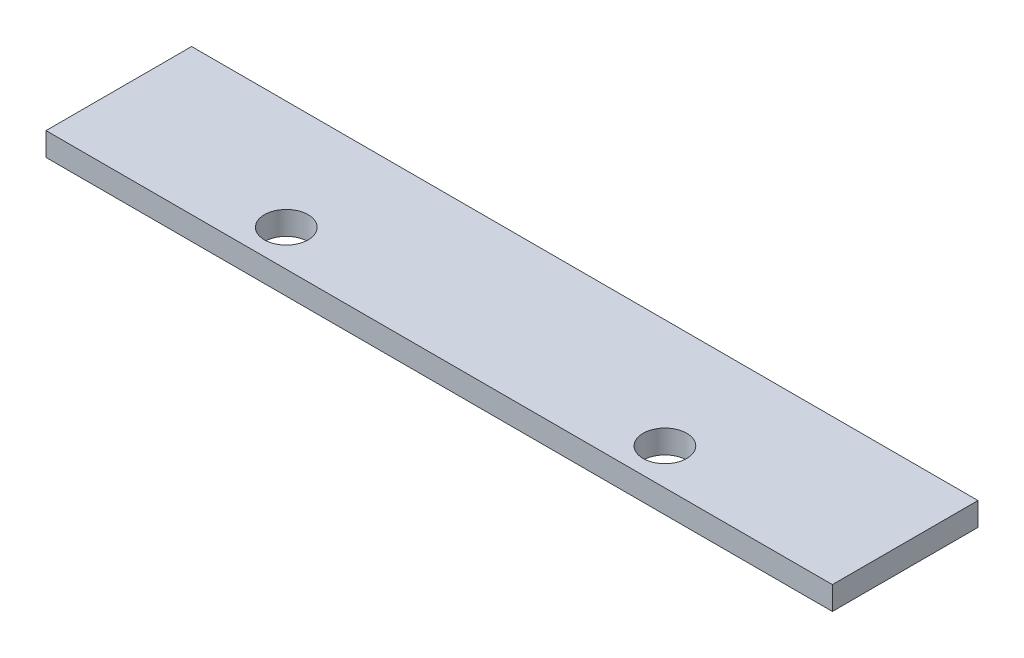
ISO-10303-21;
HEADER;
FILE_DESCRIPTION(('STEP AP214'),'2;1');
FILE_NAME('part.step','',(''),(''),'','','');
FILE_SCHEMA(('AUTOMOTIVE_DESIGN { 1 0 10303 214 1 1 1 1 }'));
ENDSEC;
DATA;
#1=APPLICATION_CONTEXT('core data for automotive mechanical design processes');
#2=APPLICATION_PROTOCOL_DEFINITION('international standard','automotive_design',2000,#1);
#3=PRODUCT_CONTEXT('',#1,'mechanical');
#4=PRODUCT('Part','Part','',(#3));
#5=PRODUCT_RELATED_PRODUCT_CATEGORY('part','',(#4));
#6=PRODUCT_DEFINITION_FORMATION('','',#4);
#7=PRODUCT_DEFINITION_CONTEXT('part definition',#1,'design');
#8=PRODUCT_DEFINITION('design','',#6,#7);
#9=PRODUCT_DEFINITION_SHAPE('','',#8);
#10=(LENGTH_UNIT() NAMED_UNIT(*) SI_UNIT(.MILLI.,.METRE.));
#11=(NAMED_UNIT(*) PLANE_ANGLE_UNIT() SI_UNIT($,.RADIAN.));
#12=(NAMED_UNIT(*) SI_UNIT($,.STERADIAN.) SOLID_ANGLE_UNIT());
#13=UNCERTAINTY_MEASURE_WITH_UNIT(LENGTH_MEASURE(1.E-05),#10,'distance_accuracy_value','');
#14=(GEOMETRIC_REPRESENTATION_CONTEXT(3) GLOBAL_UNCERTAINTY_ASSIGNED_CONTEXT((#13)) GLOBAL_UNIT_ASSIGNED_CONTEXT((#10,
#11,#12)) REPRESENTATION_CONTEXT('',''));
#15=CARTESIAN_POINT('',(0.,0.,0.));
#16=DIRECTION('',(0.,0.,1.));
#17=DIRECTION('',(1.,0.,0.));
#18=AXIS2_PLACEMENT_3D('',#15,#16,#17);
#19=CARTESIAN_POINT('',(0.,1.6,0.));
#20=DIRECTION('',(0.,1.,0.));
#21=DIRECTION('',(0.,0.,1.));
#22=AXIS2_PLACEMENT_3D('',#19,#20,#21);
#23=PLANE('',#22);
#24=CARTESIAN_POINT('',(-13.,1.6,2.49999999999999));
#25=DIRECTION('',(0.,1.,0.));
#26=DIRECTION('',(0.,0.,1.));
#27=AXIS2_PLACEMENT_3D('',#24,#25,#26);
#28=CIRCLE('',#27,1.5);
#29=CARTESIAN_POINT('',(-13.,1.6,3.99999999999999));
#30=VERTEX_POINT('',#29);
#31=EDGE_CURVE('E104',#30,#30,#28,.T.);
#32=ORIENTED_EDGE('',*,*,#31,.F.);
#33=EDGE_LOOP('',(#32));
#34=FACE_BOUND('',#33,.T.);
#35=DIRECTION('',(0.,0.,-1.));
#36=VECTOR('',#35,1.);
#37=CARTESIAN_POINT('',(27.,1.6,-5.));
#38=LINE('',#37,#36);
#39=CARTESIAN_POINT('',(27.,1.6,5.));
#40=VERTEX_POINT('',#39);
#41=CARTESIAN_POINT('',(27.,1.6,-5.));
#42=VERTEX_POINT('',#41);
#43=EDGE_CURVE('E89',#40,#42,#38,.T.);
#44=ORIENTED_EDGE('',*,*,#43,.T.);
#45=DIRECTION('',(-1.,0.,0.));
#46=VECTOR('',#45,1.);
#47=CARTESIAN_POINT('',(-27.,1.6,-5.));
#48=LINE('',#47,#46);
#49=CARTESIAN_POINT('',(-27.,1.6,-5.));
#50=VERTEX_POINT('',#49);
#51=EDGE_CURVE('E84',#42,#50,#48,.T.);
#52=ORIENTED_EDGE('',*,*,#51,.T.);
#53=DIRECTION('',(0.,0.,1.));
#54=VECTOR('',#53,1.);
#55=CARTESIAN_POINT('',(-27.,1.6,-5.));
#56=LINE('',#55,#54);
#57=CARTESIAN_POINT('',(-27.,1.6,5.));
#58=VERTEX_POINT('',#57);
#59=EDGE_CURVE('E87',#50,#58,#56,.T.);
#60=ORIENTED_EDGE('',*,*,#59,.T.);
#61=DIRECTION('',(1.,0.,0.));
#62=VECTOR('',#61,1.);
#63=CARTESIAN_POINT('',(-27.,1.6,5.));
#64=LINE('',#63,#62);
#65=EDGE_CURVE('E54',#58,#40,#64,.T.);
#66=ORIENTED_EDGE('',*,*,#65,.T.);
#67=EDGE_LOOP('',(#44,#52,#60,#66));
#68=FACE_BOUND('',#67,.T.);
#69=CARTESIAN_POINT('',(13.,1.6,2.49999999999999));
#70=DIRECTION('',(0.,1.,0.));
#71=DIRECTION('',(0.,0.,1.));
#72=AXIS2_PLACEMENT_3D('',#69,#70,#71);
#73=CIRCLE('',#72,1.5);
#74=CARTESIAN_POINT('',(13.,1.6,3.99999999999999));
#75=VERTEX_POINT('',#74);
#76=EDGE_CURVE('E119',#75,#75,#73,.T.);
#77=ORIENTED_EDGE('',*,*,#76,.F.);
#78=EDGE_LOOP('',(#77));
#79=FACE_BOUND('',#78,.T.);
#80=ADVANCED_FACE('F37',(#34,#68,#79),#23,.T.);
#81=CARTESIAN_POINT('',(0.,0.,0.));
#82=DIRECTION('',(0.,1.,0.));
#83=DIRECTION('',(0.,0.,1.));
#84=AXIS2_PLACEMENT_3D('',#81,#82,#83);
#85=PLANE('',#84);
#86=DIRECTION('',(0.,0.,-1.));
#87=VECTOR('',#86,1.);
#88=CARTESIAN_POINT('',(27.,0.,-5.));
#89=LINE('',#88,#87);
#90=CARTESIAN_POINT('',(27.,0.,5.));
#91=VERTEX_POINT('',#90);
#92=CARTESIAN_POINT('',(27.,0.,-5.));
#93=VERTEX_POINT('',#92);
#94=EDGE_CURVE('E101',#91,#93,#89,.T.);
#95=ORIENTED_EDGE('',*,*,#94,.F.);
#96=DIRECTION('',(1.,0.,0.));
#97=VECTOR('',#96,1.);
#98=CARTESIAN_POINT('',(-27.,0.,5.));
#99=LINE('',#98,#97);
#100=CARTESIAN_POINT('',(-27.,0.,5.));
#101=VERTEX_POINT('',#100);
#102=EDGE_CURVE('E77',#101,#91,#99,.T.);
#103=ORIENTED_EDGE('',*,*,#102,.F.);
#104=DIRECTION('',(0.,0.,1.));
#105=VECTOR('',#104,1.);
#106=CARTESIAN_POINT('',(-27.,0.,-5.));
#107=LINE('',#106,#105);
#108=CARTESIAN_POINT('',(-27.,0.,-5.));
#109=VERTEX_POINT('',#108);
#110=EDGE_CURVE('E71',#109,#101,#107,.T.);
#111=ORIENTED_EDGE('',*,*,#110,.F.);
#112=DIRECTION('',(-1.,0.,0.));
#113=VECTOR('',#112,1.);
#114=CARTESIAN_POINT('',(-27.,0.,-5.));
#115=LINE('',#114,#113);
#116=EDGE_CURVE('E93',#93,#109,#115,.T.);
#117=ORIENTED_EDGE('',*,*,#116,.F.);
#118=EDGE_LOOP('',(#95,#103,#111,#117));
#119=FACE_BOUND('',#118,.T.);
#120=CARTESIAN_POINT('',(-13.,0.,2.49999999999999));
#121=DIRECTION('',(0.,1.,0.));
#122=DIRECTION('',(0.,0.,1.));
#123=AXIS2_PLACEMENT_3D('',#120,#121,#122);
#124=CIRCLE('',#123,1.5);
#125=CARTESIAN_POINT('',(-13.,0.,3.99999999999999));
#126=VERTEX_POINT('',#125);
#127=EDGE_CURVE('E116',#126,#126,#124,.T.);
#128=ORIENTED_EDGE('',*,*,#127,.T.);
#129=EDGE_LOOP('',(#128));
#130=FACE_BOUND('',#129,.T.);
#131=CARTESIAN_POINT('',(13.,0.,2.49999999999999));
#132=DIRECTION('',(0.,1.,0.));
#133=DIRECTION('',(0.,0.,1.));
#134=AXIS2_PLACEMENT_3D('',#131,#132,#133);
#135=CIRCLE('',#134,1.5);
#136=CARTESIAN_POINT('',(13.,0.,3.99999999999999));
#137=VERTEX_POINT('',#136);
#138=EDGE_CURVE('E122',#137,#137,#135,.T.);
#139=ORIENTED_EDGE('',*,*,#138,.T.);
#140=EDGE_LOOP('',(#139));
#141=FACE_BOUND('',#140,.T.);
#142=ADVANCED_FACE('F112',(#119,#130,#141),#85,.F.);
#143=CARTESIAN_POINT('',(27.,1.6,-5.));
#144=DIRECTION('',(-1.,0.,0.));
#145=DIRECTION('',(0.,0.,1.));
#146=AXIS2_PLACEMENT_3D('',#143,#144,#145);
#147=PLANE('',#146);
#148=ORIENTED_EDGE('',*,*,#94,.T.);
#149=DIRECTION('',(0.,-1.,0.));
#150=VECTOR('',#149,1.);
#151=CARTESIAN_POINT('',(27.,1.6,-5.));
#152=LINE('',#151,#150);
#153=EDGE_CURVE('E11',#42,#93,#152,.T.);
#154=ORIENTED_EDGE('',*,*,#153,.F.);
#155=ORIENTED_EDGE('',*,*,#43,.F.);
#156=DIRECTION('',(0.,-1.,0.));
#157=VECTOR('',#156,1.);
#158=CARTESIAN_POINT('',(27.,1.6,5.));
#159=LINE('',#158,#157);
#160=EDGE_CURVE('E97',#40,#91,#159,.T.);
#161=ORIENTED_EDGE('',*,*,#160,.T.);
#162=EDGE_LOOP('',(#148,#154,#155,#161));
#163=FACE_BOUND('',#162,.T.);
#164=ADVANCED_FACE('F39',(#163),#147,.F.);
#165=CARTESIAN_POINT('',(-27.,1.6,-5.));
#166=DIRECTION('',(0.,0.,1.));
#167=DIRECTION('',(1.,0.,0.));
#168=AXIS2_PLACEMENT_3D('',#165,#166,#167);
#169=PLANE('',#168);
#170=ORIENTED_EDGE('',*,*,#116,.T.);
#171=DIRECTION('',(0.,-1.,0.));
#172=VECTOR('',#171,1.);
#173=CARTESIAN_POINT('',(-27.,1.6,-5.));
#174=LINE('',#173,#172);
#175=EDGE_CURVE('E46',#50,#109,#174,.T.);
#176=ORIENTED_EDGE('',*,*,#175,.F.);
#177=ORIENTED_EDGE('',*,*,#51,.F.);
#178=ORIENTED_EDGE('',*,*,#153,.T.);
#179=EDGE_LOOP('',(#170,#176,#177,#178));
#180=FACE_BOUND('',#179,.T.);
#181=ADVANCED_FACE('F92',(#180),#169,.F.);
#182=CARTESIAN_POINT('',(-27.,1.6,-5.));
#183=DIRECTION('',(1.,0.,0.));
#184=DIRECTION('',(0.,0.,-1.));
#185=AXIS2_PLACEMENT_3D('',#182,#183,#184);
#186=PLANE('',#185);
#187=ORIENTED_EDGE('',*,*,#110,.T.);
#188=DIRECTION('',(0.,-1.,0.));
#189=VECTOR('',#188,1.);
#190=CARTESIAN_POINT('',(-27.,1.6,5.));
#191=LINE('',#190,#189);
#192=EDGE_CURVE('E94',#58,#101,#191,.T.);
#193=ORIENTED_EDGE('',*,*,#192,.F.);
#194=ORIENTED_EDGE('',*,*,#59,.F.);
#195=ORIENTED_EDGE('',*,*,#175,.T.);
#196=EDGE_LOOP('',(#187,#193,#194,#195));
#197=FACE_BOUND('',#196,.T.);
#198=ADVANCED_FACE('F95',(#197),#186,.F.);
#199=CARTESIAN_POINT('',(-27.,1.6,5.));
#200=DIRECTION('',(0.,0.,-1.));
#201=DIRECTION('',(-1.,0.,0.));
#202=AXIS2_PLACEMENT_3D('',#199,#200,#201);
#203=PLANE('',#202);
#204=ORIENTED_EDGE('',*,*,#102,.T.);
#205=ORIENTED_EDGE('',*,*,#160,.F.);
#206=ORIENTED_EDGE('',*,*,#65,.F.);
#207=ORIENTED_EDGE('',*,*,#192,.T.);
#208=EDGE_LOOP('',(#204,#205,#206,#207));
#209=FACE_BOUND('',#208,.T.);
#210=ADVANCED_FACE('F109',(#209),#203,.F.);
#211=CARTESIAN_POINT('',(-13.,1.6,2.49999999999999));
#212=DIRECTION('',(0.,-1.,0.));
#213=DIRECTION('',(0.,0.,-1.));
#214=AXIS2_PLACEMENT_3D('',#211,#212,#213);
#215=CYLINDRICAL_SURFACE('',#214,1.5);
#216=ORIENTED_EDGE('',*,*,#31,.T.);
#217=EDGE_LOOP('',(#216));
#218=FACE_BOUND('',#217,.T.);
#219=ORIENTED_EDGE('',*,*,#127,.F.);
#220=EDGE_LOOP('',(#219));
#221=FACE_BOUND('',#220,.T.);
#222=ADVANCED_FACE('F139',(#218,#221),#215,.F.);
#223=CARTESIAN_POINT('',(13.,1.6,2.49999999999999));
#224=DIRECTION('',(0.,-1.,0.));
#225=DIRECTION('',(0.,0.,-1.));
#226=AXIS2_PLACEMENT_3D('',#223,#224,#225);
#227=CYLINDRICAL_SURFACE('',#226,1.5);
#228=ORIENTED_EDGE('',*,*,#76,.T.);
#229=EDGE_LOOP('',(#228));
#230=FACE_BOUND('',#229,.T.);
#231=ORIENTED_EDGE('',*,*,#138,.F.);
#232=EDGE_LOOP('',(#231));
#233=FACE_BOUND('',#232,.T.);
#234=ADVANCED_FACE('F128',(#230,#233),#227,.F.);
#235=CLOSED_SHELL('',(#80,#142,#164,#181,#198,#210,#222,#234));
#236=MANIFOLD_SOLID_BREP('B2',#235);
#237=ADVANCED_BREP_SHAPE_REPRESENTATION('',(#18,#236),#14);
#238=SHAPE_DEFINITION_REPRESENTATION(#9,#237);
ENDSEC;
END-ISO-10303-21;
